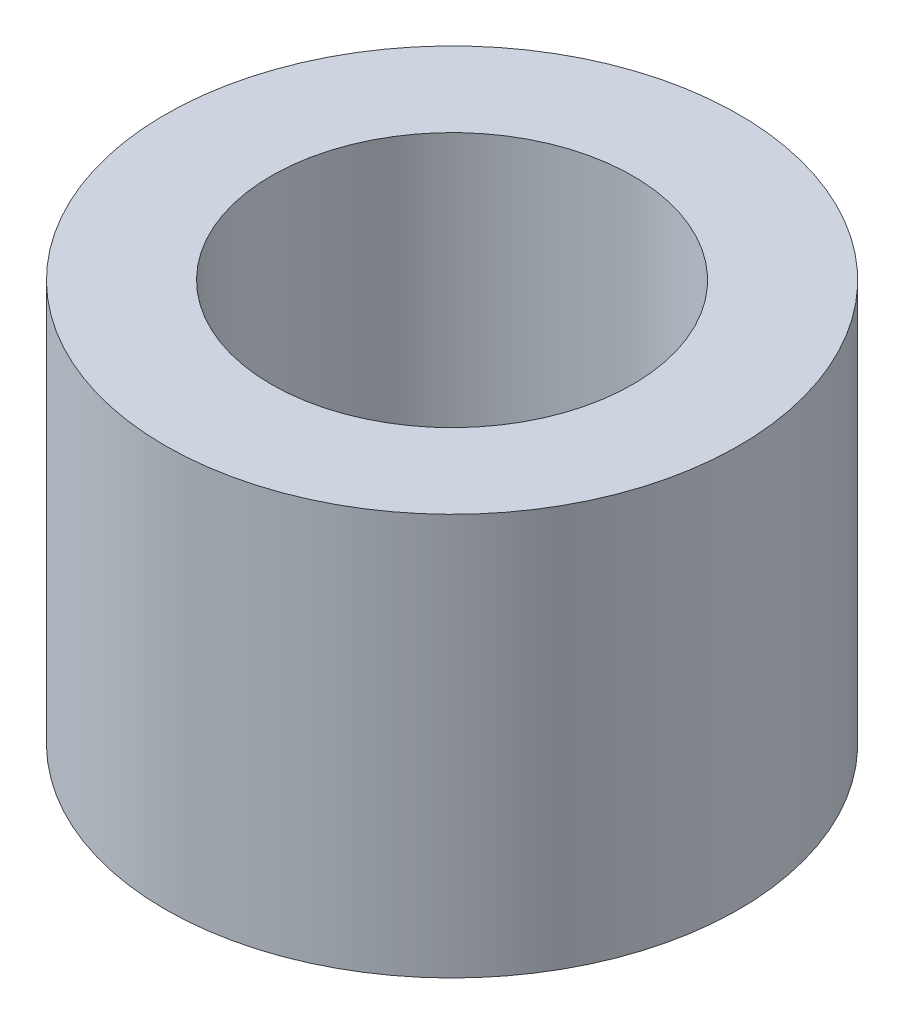
ISO-10303-21;
HEADER;
FILE_DESCRIPTION(('STEP AP214'),'2;1');
FILE_NAME('part.step','',(''),(''),'','','');
FILE_SCHEMA(('AUTOMOTIVE_DESIGN { 1 0 10303 214 1 1 1 1 }'));
ENDSEC;
DATA;
#1=APPLICATION_CONTEXT('core data for automotive mechanical design processes');
#2=APPLICATION_PROTOCOL_DEFINITION('international standard','automotive_design',2000,#1);
#3=PRODUCT_CONTEXT('',#1,'mechanical');
#4=PRODUCT('Part','Part','',(#3));
#5=PRODUCT_RELATED_PRODUCT_CATEGORY('part','',(#4));
#6=PRODUCT_DEFINITION_FORMATION('','',#4);
#7=PRODUCT_DEFINITION_CONTEXT('part definition',#1,'design');
#8=PRODUCT_DEFINITION('design','',#6,#7);
#9=PRODUCT_DEFINITION_SHAPE('','',#8);
#10=(LENGTH_UNIT() NAMED_UNIT(*) SI_UNIT(.MILLI.,.METRE.));
#11=(NAMED_UNIT(*) PLANE_ANGLE_UNIT() SI_UNIT($,.RADIAN.));
#12=(NAMED_UNIT(*) SI_UNIT($,.STERADIAN.) SOLID_ANGLE_UNIT());
#13=UNCERTAINTY_MEASURE_WITH_UNIT(LENGTH_MEASURE(1.E-05),#10,'distance_accuracy_value','');
#14=(GEOMETRIC_REPRESENTATION_CONTEXT(3) GLOBAL_UNCERTAINTY_ASSIGNED_CONTEXT((#13)) GLOBAL_UNIT_ASSIGNED_CONTEXT((#10,
#11,#12)) REPRESENTATION_CONTEXT('',''));
#15=CARTESIAN_POINT('',(0.,0.,0.));
#16=DIRECTION('',(0.,0.,1.));
#17=DIRECTION('',(1.,0.,0.));
#18=AXIS2_PLACEMENT_3D('',#15,#16,#17);
#19=CARTESIAN_POINT('',(0.,7.,0.));
#20=DIRECTION('',(0.,1.,0.));
#21=DIRECTION('',(0.,0.,1.));
#22=AXIS2_PLACEMENT_3D('',#19,#20,#21);
#23=PLANE('',#22);
#24=CARTESIAN_POINT('',(0.,7.,0.));
#25=DIRECTION('',(0.,1.,0.));
#26=DIRECTION('',(0.,0.,1.));
#27=AXIS2_PLACEMENT_3D('',#24,#25,#26);
#28=CIRCLE('',#27,5.);
#29=CARTESIAN_POINT('',(0.,7.,5.));
#30=VERTEX_POINT('',#29);
#31=EDGE_CURVE('E10',#30,#30,#28,.T.);
#32=ORIENTED_EDGE('',*,*,#31,.T.);
#33=EDGE_LOOP('',(#32));
#34=FACE_BOUND('',#33,.T.);
#35=CARTESIAN_POINT('',(0.,7.,0.));
#36=DIRECTION('',(0.,1.,0.));
#37=DIRECTION('',(0.,0.,1.));
#38=AXIS2_PLACEMENT_3D('',#35,#36,#37);
#39=CIRCLE('',#38,3.15);
#40=CARTESIAN_POINT('',(0.,7.,3.15));
#41=VERTEX_POINT('',#40);
#42=EDGE_CURVE('E54',#41,#41,#39,.T.);
#43=ORIENTED_EDGE('',*,*,#42,.F.);
#44=EDGE_LOOP('',(#43));
#45=FACE_BOUND('',#44,.T.);
#46=ADVANCED_FACE('F40',(#34,#45),#23,.T.);
#47=CARTESIAN_POINT('',(0.,0.,0.));
#48=DIRECTION('',(0.,1.,0.));
#49=DIRECTION('',(0.,0.,1.));
#50=AXIS2_PLACEMENT_3D('',#47,#48,#49);
#51=PLANE('',#50);
#52=CARTESIAN_POINT('',(0.,0.,0.));
#53=DIRECTION('',(0.,1.,0.));
#54=DIRECTION('',(0.,0.,1.));
#55=AXIS2_PLACEMENT_3D('',#52,#53,#54);
#56=CIRCLE('',#55,5.);
#57=CARTESIAN_POINT('',(0.,0.,5.));
#58=VERTEX_POINT('',#57);
#59=EDGE_CURVE('E44',#58,#58,#56,.T.);
#60=ORIENTED_EDGE('',*,*,#59,.F.);
#61=EDGE_LOOP('',(#60));
#62=FACE_BOUND('',#61,.T.);
#63=CARTESIAN_POINT('',(0.,0.,0.));
#64=DIRECTION('',(0.,1.,0.));
#65=DIRECTION('',(0.,0.,1.));
#66=AXIS2_PLACEMENT_3D('',#63,#64,#65);
#67=CIRCLE('',#66,3.15);
#68=CARTESIAN_POINT('',(0.,0.,3.15));
#69=VERTEX_POINT('',#68);
#70=EDGE_CURVE('E56',#69,#69,#67,.T.);
#71=ORIENTED_EDGE('',*,*,#70,.T.);
#72=EDGE_LOOP('',(#71));
#73=FACE_BOUND('',#72,.T.);
#74=ADVANCED_FACE('F67',(#62,#73),#51,.F.);
#75=CARTESIAN_POINT('',(0.,7.,0.));
#76=DIRECTION('',(0.,-1.,0.));
#77=DIRECTION('',(0.,0.,-1.));
#78=AXIS2_PLACEMENT_3D('',#75,#76,#77);
#79=CYLINDRICAL_SURFACE('',#78,5.);
#80=ORIENTED_EDGE('',*,*,#31,.F.);
#81=EDGE_LOOP('',(#80));
#82=FACE_BOUND('',#81,.T.);
#83=ORIENTED_EDGE('',*,*,#59,.T.);
#84=EDGE_LOOP('',(#83));
#85=FACE_BOUND('',#84,.T.);
#86=ADVANCED_FACE('F42',(#82,#85),#79,.T.);
#87=CARTESIAN_POINT('',(0.,7.,0.));
#88=DIRECTION('',(0.,-1.,0.));
#89=DIRECTION('',(0.,0.,-1.));
#90=AXIS2_PLACEMENT_3D('',#87,#88,#89);
#91=CYLINDRICAL_SURFACE('',#90,3.15);
#92=ORIENTED_EDGE('',*,*,#42,.T.);
#93=EDGE_LOOP('',(#92));
#94=FACE_BOUND('',#93,.T.);
#95=ORIENTED_EDGE('',*,*,#70,.F.);
#96=EDGE_LOOP('',(#95));
#97=FACE_BOUND('',#96,.T.);
#98=ADVANCED_FACE('F63',(#94,#97),#91,.F.);
#99=CLOSED_SHELL('',(#46,#74,#86,#98));
#100=MANIFOLD_SOLID_BREP('B2',#99);
#101=ADVANCED_BREP_SHAPE_REPRESENTATION('',(#18,#100),#14);
#102=SHAPE_DEFINITION_REPRESENTATION(#9,#101);
ENDSEC;
END-ISO-10303-21;
